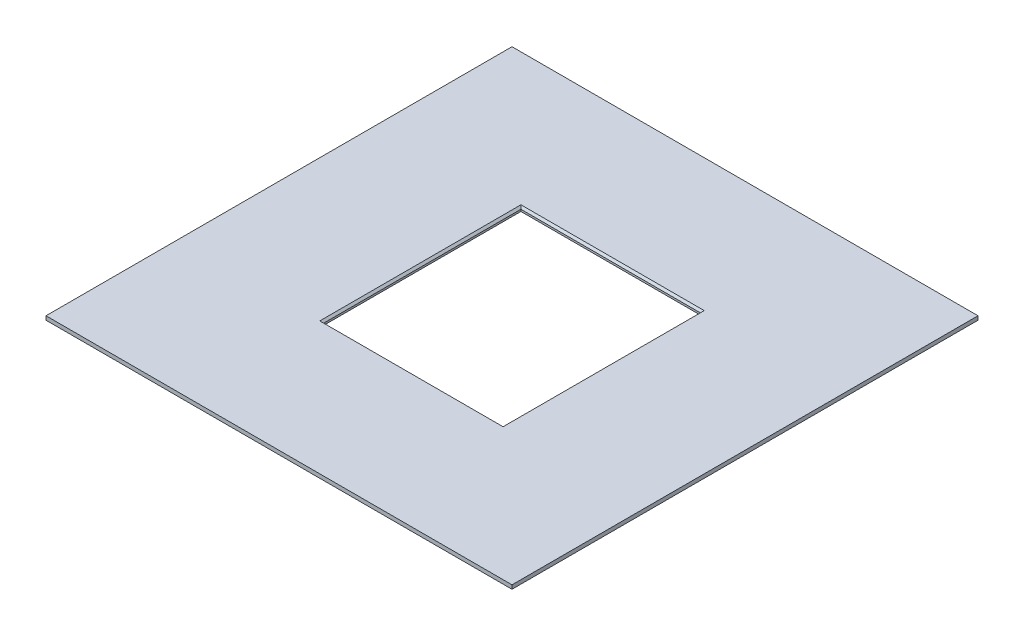
ISO-10303-21;
HEADER;
FILE_DESCRIPTION(('STEP AP214'),'2;1');
FILE_NAME('part.step','',(''),(''),'','','');
FILE_SCHEMA(('AUTOMOTIVE_DESIGN { 1 0 10303 214 1 1 1 1 }'));
ENDSEC;
DATA;
#1=APPLICATION_CONTEXT('core data for automotive mechanical design processes');
#2=APPLICATION_PROTOCOL_DEFINITION('international standard','automotive_design',2000,#1);
#3=PRODUCT_CONTEXT('',#1,'mechanical');
#4=PRODUCT('Part','Part','',(#3));
#5=PRODUCT_RELATED_PRODUCT_CATEGORY('part','',(#4));
#6=PRODUCT_DEFINITION_FORMATION('','',#4);
#7=PRODUCT_DEFINITION_CONTEXT('part definition',#1,'design');
#8=PRODUCT_DEFINITION('design','',#6,#7);
#9=PRODUCT_DEFINITION_SHAPE('','',#8);
#10=(LENGTH_UNIT() NAMED_UNIT(*) SI_UNIT(.MILLI.,.METRE.));
#11=(NAMED_UNIT(*) PLANE_ANGLE_UNIT() SI_UNIT($,.RADIAN.));
#12=(NAMED_UNIT(*) SI_UNIT($,.STERADIAN.) SOLID_ANGLE_UNIT());
#13=UNCERTAINTY_MEASURE_WITH_UNIT(LENGTH_MEASURE(1.E-05),#10,'distance_accuracy_value','');
#14=(GEOMETRIC_REPRESENTATION_CONTEXT(3) GLOBAL_UNCERTAINTY_ASSIGNED_CONTEXT((#13)) GLOBAL_UNIT_ASSIGNED_CONTEXT((#10,
#11,#12)) REPRESENTATION_CONTEXT('',''));
#15=CARTESIAN_POINT('',(0.,0.,0.));
#16=DIRECTION('',(0.,0.,1.));
#17=DIRECTION('',(1.,0.,0.));
#18=AXIS2_PLACEMENT_3D('',#15,#16,#17);
#19=CARTESIAN_POINT('',(0.,1.,0.));
#20=DIRECTION('',(0.,1.,0.));
#21=DIRECTION('',(0.,0.,1.));
#22=AXIS2_PLACEMENT_3D('',#19,#20,#21);
#23=PLANE('',#22);
#24=DIRECTION('',(-1.,0.,0.));
#25=VECTOR('',#24,1.);
#26=CARTESIAN_POINT('',(0.,1.,25.9));
#27=LINE('',#26,#25);
#28=CARTESIAN_POINT('',(23.6,1.,25.9));
#29=VERTEX_POINT('',#28);
#30=CARTESIAN_POINT('',(-23.6,1.,25.9));
#31=VERTEX_POINT('',#30);
#32=EDGE_CURVE('E212',#29,#31,#27,.T.);
#33=ORIENTED_EDGE('',*,*,#32,.T.);
#34=DIRECTION('',(0.,0.,-1.));
#35=VECTOR('',#34,1.);
#36=CARTESIAN_POINT('',(-23.6,1.,0.));
#37=LINE('',#36,#35);
#38=CARTESIAN_POINT('',(-23.6,1.,-25.9));
#39=VERTEX_POINT('',#38);
#40=EDGE_CURVE('E215',#31,#39,#37,.T.);
#41=ORIENTED_EDGE('',*,*,#40,.T.);
#42=DIRECTION('',(1.,0.,0.));
#43=VECTOR('',#42,1.);
#44=CARTESIAN_POINT('',(0.,1.,-25.9));
#45=LINE('',#44,#43);
#46=CARTESIAN_POINT('',(23.6,1.,-25.9));
#47=VERTEX_POINT('',#46);
#48=EDGE_CURVE('E206',#39,#47,#45,.T.);
#49=ORIENTED_EDGE('',*,*,#48,.T.);
#50=DIRECTION('',(0.,0.,1.));
#51=VECTOR('',#50,1.);
#52=CARTESIAN_POINT('',(23.6,1.,0.));
#53=LINE('',#52,#51);
#54=EDGE_CURVE('E209',#47,#29,#53,.T.);
#55=ORIENTED_EDGE('',*,*,#54,.T.);
#56=EDGE_LOOP('',(#33,#41,#49,#55));
#57=FACE_BOUND('',#56,.T.);
#58=DIRECTION('',(0.,0.,-1.));
#59=VECTOR('',#58,1.);
#60=CARTESIAN_POINT('',(60.,1.,-60.));
#61=LINE('',#60,#59);
#62=CARTESIAN_POINT('',(60.,1.,60.));
#63=VERTEX_POINT('',#62);
#64=CARTESIAN_POINT('',(60.,1.,-60.));
#65=VERTEX_POINT('',#64);
#66=EDGE_CURVE('E161',#63,#65,#61,.T.);
#67=ORIENTED_EDGE('',*,*,#66,.T.);
#68=DIRECTION('',(-1.,0.,0.));
#69=VECTOR('',#68,1.);
#70=CARTESIAN_POINT('',(-60.,1.,-60.));
#71=LINE('',#70,#69);
#72=CARTESIAN_POINT('',(-60.,1.,-60.));
#73=VERTEX_POINT('',#72);
#74=EDGE_CURVE('E165',#65,#73,#71,.T.);
#75=ORIENTED_EDGE('',*,*,#74,.T.);
#76=DIRECTION('',(0.,0.,1.));
#77=VECTOR('',#76,1.);
#78=CARTESIAN_POINT('',(-60.,1.,-60.));
#79=LINE('',#78,#77);
#80=CARTESIAN_POINT('',(-60.,1.,60.));
#81=VERTEX_POINT('',#80);
#82=EDGE_CURVE('E169',#73,#81,#79,.T.);
#83=ORIENTED_EDGE('',*,*,#82,.T.);
#84=DIRECTION('',(1.,0.,0.));
#85=VECTOR('',#84,1.);
#86=CARTESIAN_POINT('',(-60.,1.,60.));
#87=LINE('',#86,#85);
#88=EDGE_CURVE('E172',#81,#63,#87,.T.);
#89=ORIENTED_EDGE('',*,*,#88,.T.);
#90=EDGE_LOOP('',(#67,#75,#83,#89));
#91=FACE_BOUND('',#90,.T.);
#92=ADVANCED_FACE('F40',(#57,#91),#23,.T.);
#93=CARTESIAN_POINT('',(0.,0.,0.));
#94=DIRECTION('',(0.,1.,0.));
#95=DIRECTION('',(0.,0.,1.));
#96=AXIS2_PLACEMENT_3D('',#93,#94,#95);
#97=PLANE('',#96);
#98=DIRECTION('',(0.,0.,-1.));
#99=VECTOR('',#98,1.);
#100=CARTESIAN_POINT('',(60.,0.,-60.));
#101=LINE('',#100,#99);
#102=CARTESIAN_POINT('',(60.,0.,60.));
#103=VERTEX_POINT('',#102);
#104=CARTESIAN_POINT('',(60.,0.,-60.));
#105=VERTEX_POINT('',#104);
#106=EDGE_CURVE('E127',#103,#105,#101,.T.);
#107=ORIENTED_EDGE('',*,*,#106,.F.);
#108=DIRECTION('',(1.,0.,0.));
#109=VECTOR('',#108,1.);
#110=CARTESIAN_POINT('',(-60.,0.,60.));
#111=LINE('',#110,#109);
#112=CARTESIAN_POINT('',(-60.,0.,60.));
#113=VERTEX_POINT('',#112);
#114=EDGE_CURVE('E166',#113,#103,#111,.T.);
#115=ORIENTED_EDGE('',*,*,#114,.F.);
#116=DIRECTION('',(0.,0.,1.));
#117=VECTOR('',#116,1.);
#118=CARTESIAN_POINT('',(-60.,0.,-60.));
#119=LINE('',#118,#117);
#120=CARTESIAN_POINT('',(-60.,0.,-60.));
#121=VERTEX_POINT('',#120);
#122=EDGE_CURVE('E182',#121,#113,#119,.T.);
#123=ORIENTED_EDGE('',*,*,#122,.F.);
#124=DIRECTION('',(-1.,0.,0.));
#125=VECTOR('',#124,1.);
#126=CARTESIAN_POINT('',(-60.,0.,-60.));
#127=LINE('',#126,#125);
#128=EDGE_CURVE('E179',#105,#121,#127,.T.);
#129=ORIENTED_EDGE('',*,*,#128,.F.);
#130=EDGE_LOOP('',(#107,#115,#123,#129));
#131=FACE_BOUND('',#130,.T.);
#132=DIRECTION('',(0.,0.,-1.));
#133=VECTOR('',#132,1.);
#134=CARTESIAN_POINT('',(23.1,0.,-25.4));
#135=LINE('',#134,#133);
#136=CARTESIAN_POINT('',(23.1,0.,25.4));
#137=VERTEX_POINT('',#136);
#138=CARTESIAN_POINT('',(23.1,0.,-25.4));
#139=VERTEX_POINT('',#138);
#140=EDGE_CURVE('E122',#137,#139,#135,.T.);
#141=ORIENTED_EDGE('',*,*,#140,.T.);
#142=DIRECTION('',(-1.,0.,0.));
#143=VECTOR('',#142,1.);
#144=CARTESIAN_POINT('',(-23.1,0.,-25.4));
#145=LINE('',#144,#143);
#146=CARTESIAN_POINT('',(-23.1,0.,-25.4));
#147=VERTEX_POINT('',#146);
#148=EDGE_CURVE('E131',#139,#147,#145,.T.);
#149=ORIENTED_EDGE('',*,*,#148,.T.);
#150=DIRECTION('',(0.,0.,1.));
#151=VECTOR('',#150,1.);
#152=CARTESIAN_POINT('',(-23.1,0.,-25.4));
#153=LINE('',#152,#151);
#154=CARTESIAN_POINT('',(-23.1,0.,25.4));
#155=VERTEX_POINT('',#154);
#156=EDGE_CURVE('E138',#147,#155,#153,.T.);
#157=ORIENTED_EDGE('',*,*,#156,.T.);
#158=DIRECTION('',(1.,0.,0.));
#159=VECTOR('',#158,1.);
#160=CARTESIAN_POINT('',(-23.1,0.,25.4));
#161=LINE('',#160,#159);
#162=EDGE_CURVE('E142',#155,#137,#161,.T.);
#163=ORIENTED_EDGE('',*,*,#162,.T.);
#164=EDGE_LOOP('',(#141,#149,#157,#163));
#165=FACE_BOUND('',#164,.T.);
#166=ADVANCED_FACE('F140',(#131,#165),#97,.F.);
#167=CARTESIAN_POINT('',(60.,1.,-60.));
#168=DIRECTION('',(-1.,0.,0.));
#169=DIRECTION('',(0.,0.,1.));
#170=AXIS2_PLACEMENT_3D('',#167,#168,#169);
#171=PLANE('',#170);
#172=ORIENTED_EDGE('',*,*,#106,.T.);
#173=DIRECTION('',(0.,-1.,0.));
#174=VECTOR('',#173,1.);
#175=CARTESIAN_POINT('',(60.,1.,-60.));
#176=LINE('',#175,#174);
#177=EDGE_CURVE('E198',#65,#105,#176,.T.);
#178=ORIENTED_EDGE('',*,*,#177,.F.);
#179=ORIENTED_EDGE('',*,*,#66,.F.);
#180=DIRECTION('',(0.,-1.,0.));
#181=VECTOR('',#180,1.);
#182=CARTESIAN_POINT('',(60.,1.,60.));
#183=LINE('',#182,#181);
#184=EDGE_CURVE('E175',#63,#103,#183,.T.);
#185=ORIENTED_EDGE('',*,*,#184,.T.);
#186=EDGE_LOOP('',(#172,#178,#179,#185));
#187=FACE_BOUND('',#186,.T.);
#188=ADVANCED_FACE('F262',(#187),#171,.F.);
#189=CARTESIAN_POINT('',(-60.,1.,-60.));
#190=DIRECTION('',(0.,0.,1.));
#191=DIRECTION('',(1.,0.,0.));
#192=AXIS2_PLACEMENT_3D('',#189,#190,#191);
#193=PLANE('',#192);
#194=ORIENTED_EDGE('',*,*,#128,.T.);
#195=DIRECTION('',(0.,-1.,0.));
#196=VECTOR('',#195,1.);
#197=CARTESIAN_POINT('',(-60.,1.,-60.));
#198=LINE('',#197,#196);
#199=EDGE_CURVE('E194',#73,#121,#198,.T.);
#200=ORIENTED_EDGE('',*,*,#199,.F.);
#201=ORIENTED_EDGE('',*,*,#74,.F.);
#202=ORIENTED_EDGE('',*,*,#177,.T.);
#203=EDGE_LOOP('',(#194,#200,#201,#202));
#204=FACE_BOUND('',#203,.T.);
#205=ADVANCED_FACE('F276',(#204),#193,.F.);
#206=CARTESIAN_POINT('',(-60.,1.,-60.));
#207=DIRECTION('',(1.,0.,0.));
#208=DIRECTION('',(0.,0.,-1.));
#209=AXIS2_PLACEMENT_3D('',#206,#207,#208);
#210=PLANE('',#209);
#211=ORIENTED_EDGE('',*,*,#122,.T.);
#212=DIRECTION('',(0.,-1.,0.));
#213=VECTOR('',#212,1.);
#214=CARTESIAN_POINT('',(-60.,1.,60.));
#215=LINE('',#214,#213);
#216=EDGE_CURVE('E190',#81,#113,#215,.T.);
#217=ORIENTED_EDGE('',*,*,#216,.F.);
#218=ORIENTED_EDGE('',*,*,#82,.F.);
#219=ORIENTED_EDGE('',*,*,#199,.T.);
#220=EDGE_LOOP('',(#211,#217,#218,#219));
#221=FACE_BOUND('',#220,.T.);
#222=ADVANCED_FACE('F272',(#221),#210,.F.);
#223=CARTESIAN_POINT('',(-60.,1.,60.));
#224=DIRECTION('',(0.,0.,-1.));
#225=DIRECTION('',(-1.,0.,0.));
#226=AXIS2_PLACEMENT_3D('',#223,#224,#225);
#227=PLANE('',#226);
#228=ORIENTED_EDGE('',*,*,#114,.T.);
#229=ORIENTED_EDGE('',*,*,#184,.F.);
#230=ORIENTED_EDGE('',*,*,#88,.F.);
#231=ORIENTED_EDGE('',*,*,#216,.T.);
#232=EDGE_LOOP('',(#228,#229,#230,#231));
#233=FACE_BOUND('',#232,.T.);
#234=ADVANCED_FACE('F269',(#233),#227,.F.);
#235=CARTESIAN_POINT('',(23.1,1.,-25.4));
#236=DIRECTION('',(-1.,0.,0.));
#237=DIRECTION('',(0.,0.,1.));
#238=AXIS2_PLACEMENT_3D('',#235,#236,#237);
#239=PLANE('',#238);
#240=DIRECTION('',(0.,-1.,0.));
#241=VECTOR('',#240,1.);
#242=CARTESIAN_POINT('',(23.1,1.,25.4));
#243=LINE('',#242,#241);
#244=CARTESIAN_POINT('',(23.1,0.5,25.4));
#245=VERTEX_POINT('',#244);
#246=EDGE_CURVE('E153',#245,#137,#243,.T.);
#247=ORIENTED_EDGE('',*,*,#246,.F.);
#248=DIRECTION('',(0.,0.,-1.));
#249=VECTOR('',#248,1.);
#250=CARTESIAN_POINT('',(23.1,0.5,-25.4));
#251=LINE('',#250,#249);
#252=CARTESIAN_POINT('',(23.1,0.5,-25.4));
#253=VERTEX_POINT('',#252);
#254=EDGE_CURVE('E51',#245,#253,#251,.T.);
#255=ORIENTED_EDGE('',*,*,#254,.T.);
#256=DIRECTION('',(0.,-1.,0.));
#257=VECTOR('',#256,1.);
#258=CARTESIAN_POINT('',(23.1,1.,-25.4));
#259=LINE('',#258,#257);
#260=EDGE_CURVE('E118',#253,#139,#259,.T.);
#261=ORIENTED_EDGE('',*,*,#260,.T.);
#262=ORIENTED_EDGE('',*,*,#140,.F.);
#263=EDGE_LOOP('',(#247,#255,#261,#262));
#264=FACE_BOUND('',#263,.T.);
#265=ADVANCED_FACE('F120',(#264),#239,.T.);
#266=CARTESIAN_POINT('',(-23.1,1.,-25.4));
#267=DIRECTION('',(0.,0.,1.));
#268=DIRECTION('',(1.,0.,0.));
#269=AXIS2_PLACEMENT_3D('',#266,#267,#268);
#270=PLANE('',#269);
#271=ORIENTED_EDGE('',*,*,#260,.F.);
#272=DIRECTION('',(-1.,0.,0.));
#273=VECTOR('',#272,1.);
#274=CARTESIAN_POINT('',(-23.1,0.5,-25.4));
#275=LINE('',#274,#273);
#276=CARTESIAN_POINT('',(-23.1,0.5,-25.4));
#277=VERTEX_POINT('',#276);
#278=EDGE_CURVE('E11',#253,#277,#275,.T.);
#279=ORIENTED_EDGE('',*,*,#278,.T.);
#280=DIRECTION('',(0.,-1.,0.));
#281=VECTOR('',#280,1.);
#282=CARTESIAN_POINT('',(-23.1,1.,-25.4));
#283=LINE('',#282,#281);
#284=EDGE_CURVE('E128',#277,#147,#283,.T.);
#285=ORIENTED_EDGE('',*,*,#284,.T.);
#286=ORIENTED_EDGE('',*,*,#148,.F.);
#287=EDGE_LOOP('',(#271,#279,#285,#286));
#288=FACE_BOUND('',#287,.T.);
#289=ADVANCED_FACE('F132',(#288),#270,.T.);
#290=CARTESIAN_POINT('',(-23.1,1.,-25.4));
#291=DIRECTION('',(1.,0.,0.));
#292=DIRECTION('',(0.,0.,-1.));
#293=AXIS2_PLACEMENT_3D('',#290,#291,#292);
#294=PLANE('',#293);
#295=ORIENTED_EDGE('',*,*,#284,.F.);
#296=DIRECTION('',(0.,0.,1.));
#297=VECTOR('',#296,1.);
#298=CARTESIAN_POINT('',(-23.1,0.5,-25.4));
#299=LINE('',#298,#297);
#300=CARTESIAN_POINT('',(-23.1,0.5,25.4));
#301=VERTEX_POINT('',#300);
#302=EDGE_CURVE('E202',#277,#301,#299,.T.);
#303=ORIENTED_EDGE('',*,*,#302,.T.);
#304=DIRECTION('',(0.,-1.,0.));
#305=VECTOR('',#304,1.);
#306=CARTESIAN_POINT('',(-23.1,1.,25.4));
#307=LINE('',#306,#305);
#308=EDGE_CURVE('E156',#301,#155,#307,.T.);
#309=ORIENTED_EDGE('',*,*,#308,.T.);
#310=ORIENTED_EDGE('',*,*,#156,.F.);
#311=EDGE_LOOP('',(#295,#303,#309,#310));
#312=FACE_BOUND('',#311,.T.);
#313=ADVANCED_FACE('F244',(#312),#294,.T.);
#314=CARTESIAN_POINT('',(-23.1,1.,25.4));
#315=DIRECTION('',(0.,0.,-1.));
#316=DIRECTION('',(-1.,0.,0.));
#317=AXIS2_PLACEMENT_3D('',#314,#315,#316);
#318=PLANE('',#317);
#319=ORIENTED_EDGE('',*,*,#308,.F.);
#320=DIRECTION('',(1.,0.,0.));
#321=VECTOR('',#320,1.);
#322=CARTESIAN_POINT('',(-23.1,0.5,25.4));
#323=LINE('',#322,#321);
#324=EDGE_CURVE('E66',#301,#245,#323,.T.);
#325=ORIENTED_EDGE('',*,*,#324,.T.);
#326=ORIENTED_EDGE('',*,*,#246,.T.);
#327=ORIENTED_EDGE('',*,*,#162,.F.);
#328=EDGE_LOOP('',(#319,#325,#326,#327));
#329=FACE_BOUND('',#328,.T.);
#330=ADVANCED_FACE('F245',(#329),#318,.T.);
#331=CARTESIAN_POINT('',(23.1,0.5,-25.4));
#332=DIRECTION('',(0.707106781186544,-0.707106781186551,0.));
#333=DIRECTION('',(0.,0.,-1.));
#334=AXIS2_PLACEMENT_3D('',#331,#332,#333);
#335=PLANE('',#334);
#336=DIRECTION('',(0.57735026918963,0.577350269189624,0.577350269189624));
#337=VECTOR('',#336,1.);
#338=CARTESIAN_POINT('',(7.69999999999979,-14.9000000000001,9.99999999999992));
#339=LINE('',#338,#337);
#340=EDGE_CURVE('E147',#29,#245,#339,.F.);
#341=ORIENTED_EDGE('',*,*,#340,.F.);
#342=ORIENTED_EDGE('',*,*,#54,.F.);
#343=DIRECTION('',(0.57735026918963,0.577350269189624,-0.577350269189624));
#344=VECTOR('',#343,1.);
#345=CARTESIAN_POINT('',(23.1,0.5,-25.4));
#346=LINE('',#345,#344);
#347=EDGE_CURVE('E45',#253,#47,#346,.T.);
#348=ORIENTED_EDGE('',*,*,#347,.F.);
#349=ORIENTED_EDGE('',*,*,#254,.F.);
#350=EDGE_LOOP('',(#341,#342,#348,#349));
#351=FACE_BOUND('',#350,.T.);
#352=ADVANCED_FACE('F43',(#351),#335,.F.);
#353=CARTESIAN_POINT('',(-23.1,0.5,-25.4));
#354=DIRECTION('',(0.,-0.707106781186547,-0.707106781186547));
#355=DIRECTION('',(-1.,0.,0.));
#356=AXIS2_PLACEMENT_3D('',#353,#354,#355);
#357=PLANE('',#356);
#358=ORIENTED_EDGE('',*,*,#347,.T.);
#359=ORIENTED_EDGE('',*,*,#48,.F.);
#360=DIRECTION('',(0.577350269189626,-0.577350269189626,0.577350269189626));
#361=VECTOR('',#360,1.);
#362=CARTESIAN_POINT('',(-23.1,0.5,-25.4));
#363=LINE('',#362,#361);
#364=EDGE_CURVE('E226',#277,#39,#363,.F.);
#365=ORIENTED_EDGE('',*,*,#364,.F.);
#366=ORIENTED_EDGE('',*,*,#278,.F.);
#367=EDGE_LOOP('',(#358,#359,#365,#366));
#368=FACE_BOUND('',#367,.T.);
#369=ADVANCED_FACE('F241',(#368),#357,.F.);
#370=CARTESIAN_POINT('',(-23.1,0.5,25.4));
#371=DIRECTION('',(0.,-0.707106781186547,0.707106781186547));
#372=DIRECTION('',(1.,0.,0.));
#373=AXIS2_PLACEMENT_3D('',#370,#371,#372);
#374=PLANE('',#373);
#375=ORIENTED_EDGE('',*,*,#340,.T.);
#376=ORIENTED_EDGE('',*,*,#324,.F.);
#377=DIRECTION('',(-0.577350269189626,0.577350269189626,0.577350269189626));
#378=VECTOR('',#377,1.);
#379=CARTESIAN_POINT('',(-6.16666666666667,-16.4333333333333,8.46666666666664));
#380=LINE('',#379,#378);
#381=EDGE_CURVE('E223',#31,#301,#380,.F.);
#382=ORIENTED_EDGE('',*,*,#381,.F.);
#383=ORIENTED_EDGE('',*,*,#32,.F.);
#384=EDGE_LOOP('',(#375,#376,#382,#383));
#385=FACE_BOUND('',#384,.T.);
#386=ADVANCED_FACE('F233',(#385),#374,.F.);
#387=CARTESIAN_POINT('',(-23.1,0.5,-25.4));
#388=DIRECTION('',(-0.707106781186547,-0.707106781186547,0.));
#389=DIRECTION('',(0.,0.,1.));
#390=AXIS2_PLACEMENT_3D('',#387,#388,#389);
#391=PLANE('',#390);
#392=ORIENTED_EDGE('',*,*,#364,.T.);
#393=ORIENTED_EDGE('',*,*,#40,.F.);
#394=ORIENTED_EDGE('',*,*,#381,.T.);
#395=ORIENTED_EDGE('',*,*,#302,.F.);
#396=EDGE_LOOP('',(#392,#393,#394,#395));
#397=FACE_BOUND('',#396,.T.);
#398=ADVANCED_FACE('F285',(#397),#391,.F.);
#399=CLOSED_SHELL('',(#92,#166,#188,#205,#222,#234,#265,#289,#313,#330,#352,#369,#386,#398));
#400=MANIFOLD_SOLID_BREP('B2',#399);
#401=ADVANCED_BREP_SHAPE_REPRESENTATION('',(#18,#400),#14);
#402=SHAPE_DEFINITION_REPRESENTATION(#9,#401);
ENDSEC;
END-ISO-10303-21;
